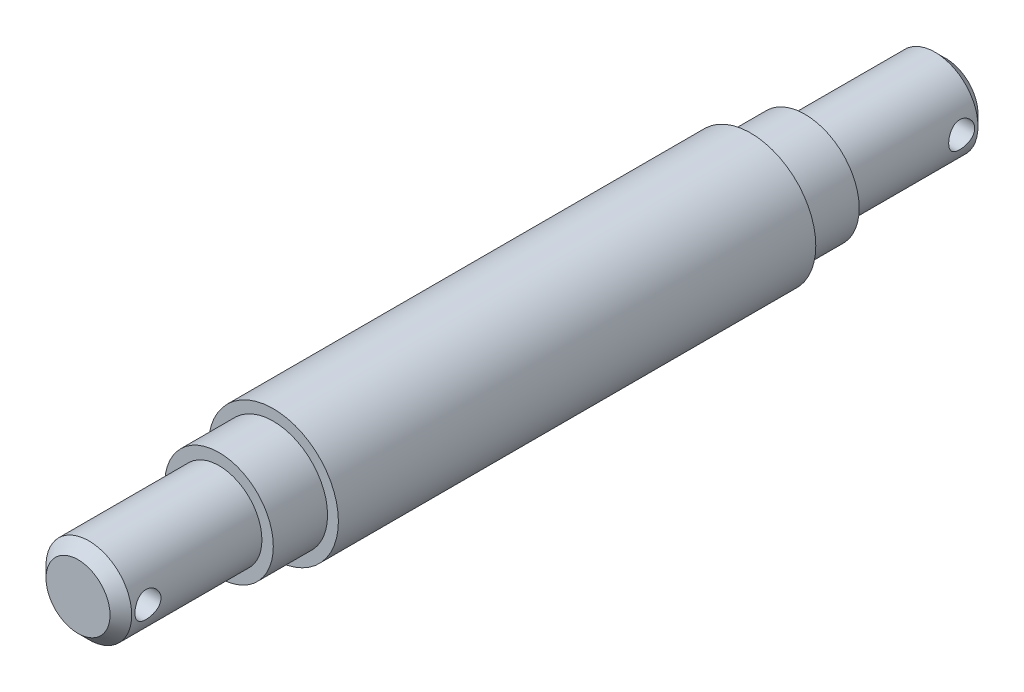
ISO-10303-21;
HEADER;
FILE_DESCRIPTION(('STEP AP214'),'2;1');
FILE_NAME('part.step','',(''),(''),'','','');
FILE_SCHEMA(('AUTOMOTIVE_DESIGN { 1 0 10303 214 1 1 1 1 }'));
ENDSEC;
DATA;
#1=APPLICATION_CONTEXT('core data for automotive mechanical design processes');
#2=APPLICATION_PROTOCOL_DEFINITION('international standard','automotive_design',2000,#1);
#3=PRODUCT_CONTEXT('',#1,'mechanical');
#4=PRODUCT('Part','Part','',(#3));
#5=PRODUCT_RELATED_PRODUCT_CATEGORY('part','',(#4));
#6=PRODUCT_DEFINITION_FORMATION('','',#4);
#7=PRODUCT_DEFINITION_CONTEXT('part definition',#1,'design');
#8=PRODUCT_DEFINITION('design','',#6,#7);
#9=PRODUCT_DEFINITION_SHAPE('','',#8);
#10=(LENGTH_UNIT() NAMED_UNIT(*) SI_UNIT(.MILLI.,.METRE.));
#11=(NAMED_UNIT(*) PLANE_ANGLE_UNIT() SI_UNIT($,.RADIAN.));
#12=(NAMED_UNIT(*) SI_UNIT($,.STERADIAN.) SOLID_ANGLE_UNIT());
#13=UNCERTAINTY_MEASURE_WITH_UNIT(LENGTH_MEASURE(1.E-05),#10,'distance_accuracy_value','');
#14=(GEOMETRIC_REPRESENTATION_CONTEXT(3) GLOBAL_UNCERTAINTY_ASSIGNED_CONTEXT((#13)) GLOBAL_UNIT_ASSIGNED_CONTEXT((#10,
#11,#12)) REPRESENTATION_CONTEXT('',''));
#15=CARTESIAN_POINT('',(0.,0.,0.));
#16=DIRECTION('',(0.,0.,1.));
#17=DIRECTION('',(1.,0.,0.));
#18=AXIS2_PLACEMENT_3D('',#15,#16,#17);
#19=CARTESIAN_POINT('',(0.,0.,-40.));
#20=DIRECTION('',(0.,0.,1.));
#21=DIRECTION('',(1.,0.,0.));
#22=AXIS2_PLACEMENT_3D('',#19,#20,#21);
#23=CYLINDRICAL_SURFACE('',#22,3.95);
#24=CARTESIAN_POINT('',(0.,0.,-39.));
#25=DIRECTION('',(0.,0.,-1.));
#26=DIRECTION('',(-1.,0.,0.));
#27=AXIS2_PLACEMENT_3D('',#24,#25,#26);
#28=CIRCLE('',#27,3.95);
#29=CARTESIAN_POINT('',(-3.95,0.,-39.));
#30=VERTEX_POINT('',#29);
#31=EDGE_CURVE('E42',#30,#30,#28,.F.);
#32=ORIENTED_EDGE('',*,*,#31,.T.);
#33=EDGE_LOOP('',(#32));
#34=FACE_BOUND('',#33,.T.);
#35=CARTESIAN_POINT('',(-3.95,0.,-38.7));
#36=CARTESIAN_POINT('',(-3.94999950148961,0.0657921053393099,-38.699999309067));
#37=CARTESIAN_POINT('',(-3.94834057311497,0.131591214838204,-38.6945713423082));
#38=CARTESIAN_POINT('',(-3.94188498697175,0.261270865350394,-38.6730560327882));
#39=CARTESIAN_POINT('',(-3.93708746139313,0.32515087062796,-38.6569657419196));
#40=CARTESIAN_POINT('',(-3.92487988296748,0.449103270402125,-38.6147143702164));
#41=CARTESIAN_POINT('',(-3.91747374305666,0.509181209664441,-38.5885683676363));
#42=CARTESIAN_POINT('',(-3.90081718663398,0.624100282433904,-38.5270102908556));
#43=CARTESIAN_POINT('',(-3.89156651099519,0.67894067854965,-38.4915969145227));
#44=CARTESIAN_POINT('',(-3.87190239177238,0.783438437222789,-38.4114139294501));
#45=CARTESIAN_POINT('',(-3.86146466337096,0.832920325244448,-38.3664216080813));
#46=CARTESIAN_POINT('',(-3.84074643294284,0.923765255505195,-38.2688324305187));
#47=CARTESIAN_POINT('',(-3.83046595848297,0.965126888957127,-38.2162342575258));
#48=CARTESIAN_POINT('',(-3.81096820781043,1.03948900030353,-38.1034313998918));
#49=CARTESIAN_POINT('',(-3.80178104820255,1.07227379069014,-38.0430788331166));
#50=CARTESIAN_POINT('',(-3.78587377700204,1.12715664878844,-37.9173927923664));
#51=CARTESIAN_POINT('',(-3.77915305597243,1.14925735687915,-37.8520605536529));
#52=CARTESIAN_POINT('',(-3.76919296296908,1.18150913793118,-37.7202430842059));
#53=CARTESIAN_POINT('',(-3.76585939822971,1.19198431895655,-37.6538444632701));
#54=CARTESIAN_POINT('',(-3.76277100880303,1.20169991107967,-37.5201549851538));
#55=CARTESIAN_POINT('',(-3.76301529202458,1.20094312272632,-37.4528643545652));
#56=CARTESIAN_POINT('',(-3.76697161773738,1.1884705081571,-37.3219501570623));
#57=CARTESIAN_POINT('',(-3.7705546058486,1.17716250700933,-37.2582831860542));
#58=CARTESIAN_POINT('',(-3.78057558453502,1.14456806673587,-37.1337964711495));
#59=CARTESIAN_POINT('',(-3.7870138633498,1.12328062017983,-37.0729770153932));
#60=CARTESIAN_POINT('',(-3.80212175360936,1.07103490290146,-36.9549220552885));
#61=CARTESIAN_POINT('',(-3.81082129239325,1.03994563160967,-36.897748519544));
#62=CARTESIAN_POINT('',(-3.82945730084039,0.969069803090082,-36.7892941375805));
#63=CARTESIAN_POINT('',(-3.8393940765405,0.929281092164123,-36.7380147553671));
#64=CARTESIAN_POINT('',(-3.85990662941459,0.840117660833637,-36.6404934453549));
#65=CARTESIAN_POINT('',(-3.87049153542939,0.790405027053214,-36.594561848265));
#66=CARTESIAN_POINT('',(-3.8907306221033,0.68385092805617,-36.5116141422669));
#67=CARTESIAN_POINT('',(-3.90038474113935,0.627008991414055,-36.474598623408));
#68=CARTESIAN_POINT('',(-3.91776652995739,0.507235607809567,-36.4103388738867));
#69=CARTESIAN_POINT('',(-3.92548020503653,0.444264225815946,-36.3831650382017));
#70=CARTESIAN_POINT('',(-3.93801108754001,0.314356032727513,-36.3398862787667));
#71=CARTESIAN_POINT('',(-3.94282912421219,0.247420362956474,-36.3237781858395));
#72=CARTESIAN_POINT('',(-3.94889402423303,0.114120636053965,-36.3036084028364));
#73=CARTESIAN_POINT('',(-3.95026547137128,0.0478257706931102,-36.2991262681458));
#74=CARTESIAN_POINT('',(-3.94964905795108,-0.084573966489267,-36.3011550878346));
#75=CARTESIAN_POINT('',(-3.94766165842204,-0.150678863138071,-36.3076645335288));
#76=CARTESIAN_POINT('',(-3.94063250926793,-0.279224843718514,-36.3311524846441));
#77=CARTESIAN_POINT('',(-3.93566287748284,-0.341715383064581,-36.3478839633591));
#78=CARTESIAN_POINT('',(-3.9232462867588,-0.462987512144225,-36.3910425635287));
#79=CARTESIAN_POINT('',(-3.91579902739437,-0.521768651064519,-36.4174708608141));
#80=CARTESIAN_POINT('',(-3.89897895098375,-0.635489778460971,-36.4799699305355));
#81=CARTESIAN_POINT('',(-3.88956496603778,-0.690306912058744,-36.5162528662978));
#82=CARTESIAN_POINT('',(-3.86989097410411,-0.793217107200203,-36.5971744514623));
#83=CARTESIAN_POINT('',(-3.85963075016098,-0.84130843583642,-36.6418152473685));
#84=CARTESIAN_POINT('',(-3.8389403158374,-0.931262194728945,-36.7401615057772));
#85=CARTESIAN_POINT('',(-3.82851804368209,-0.972825315903962,-36.7941430083754));
#86=CARTESIAN_POINT('',(-3.8090881755083,-1.04632580306949,-36.9085410089933));
#87=CARTESIAN_POINT('',(-3.80008054641565,-1.07826339411975,-36.9689573565118));
#88=CARTESIAN_POINT('',(-3.78460257028509,-1.13139313809661,-37.0943366498449));
#89=CARTESIAN_POINT('',(-3.77812098085674,-1.15263302867236,-37.1592778979753));
#90=CARTESIAN_POINT('',(-3.76847037643667,-1.18380847718296,-37.2920499847157));
#91=CARTESIAN_POINT('',(-3.76530018925136,-1.1937480353996,-37.3598797919581));
#92=CARTESIAN_POINT('',(-3.76274882724403,-1.20176405179564,-37.4933883668788));
#93=CARTESIAN_POINT('',(-3.76321151382289,-1.20032934218194,-37.559035178016));
#94=CARTESIAN_POINT('',(-3.76749719259433,-1.18680835860971,-37.6891050998603));
#95=CARTESIAN_POINT('',(-3.77132004375065,-1.17472253171075,-37.7535282618118));
#96=CARTESIAN_POINT('',(-3.78178924861813,-1.14056150948796,-37.8785005993841));
#97=CARTESIAN_POINT('',(-3.7883980639779,-1.11861887679373,-37.9390893895407));
#98=CARTESIAN_POINT('',(-3.80368682812306,-1.06547063438703,-38.0557739216337));
#99=CARTESIAN_POINT('',(-3.81236718094976,-1.03426321734227,-38.1118687842014));
#100=CARTESIAN_POINT('',(-3.83122441855044,-0.962110752635532,-38.2202335502225));
#101=CARTESIAN_POINT('',(-3.84144499898209,-0.920846329538669,-38.2722831917953));
#102=CARTESIAN_POINT('',(-3.86202232713825,-0.830322181374976,-38.3688776312579));
#103=CARTESIAN_POINT('',(-3.872379109857,-0.781060363153478,-38.4134204581551));
#104=CARTESIAN_POINT('',(-3.89243751616363,-0.674145848788933,-38.4950812638234));
#105=CARTESIAN_POINT('',(-3.90210985106116,-0.616284435684861,-38.5319339365529));
#106=CARTESIAN_POINT('',(-3.91935319911683,-0.494893212202998,-38.5953376113773));
#107=CARTESIAN_POINT('',(-3.92692514826385,-0.431365943417147,-38.6218932042363));
#108=CARTESIAN_POINT('',(-3.93849330935894,-0.307034616834357,-38.6617030372843));
#109=CARTESIAN_POINT('',(-3.94277212268364,-0.246597141950738,-38.6760247532901));
#110=CARTESIAN_POINT('',(-3.94852545465588,-0.124108329921256,-38.6951727192245));
#111=CARTESIAN_POINT('',(-3.95000047021142,-0.0620572807202991,-38.7000006517107));
#112=CARTESIAN_POINT('',(-3.95,0.,-38.7));
#113=B_SPLINE_CURVE_WITH_KNOTS('',3,(#35,#36,#37,#38,#39,#40,#41,#42,#43,#44,#45,#46,#47,#48,
#49,#50,#51,#52,#53,#54,#55,#56,#57,#58,#59,#60,#61,#62,#63,#64,#65,#66,#67,#68,#69,#70,#71,#72,
#73,#74,#75,#76,#77,#78,#79,#80,#81,#82,#83,#84,#85,#86,#87,#88,#89,#90,#91,#92,#93,#94,#95,#96,
#97,#98,#99,#100,#101,#102,#103,#104,#105,#106,#107,#108,#109,#110,#111,#112),.UNSPECIFIED.,.T.,
.F.,(4,2,2,2,2,2,2,2,2,2,2,2,2,2,2,2,2,2,2,2,2,2,2,2,2,2,2,2,2,2,2,2,2,2,2,2,2,2,4),(0.,
0.197148320035393,0.394351173873385,0.591259473294286,0.788195454606494,0.990340802366876,
1.19252118949645,1.39938126808359,1.60619019875128,1.80707614853398,2.00791201079835,
2.20129315930618,2.39469383394964,2.59079745889567,2.78694968780097,2.99151370492323,
3.19609125598955,3.40210447220443,3.6080586625695,3.80645362401528,4.00482135632749,
4.19857515486446,4.39235245564506,4.59068721838335,4.7890729884132,4.99485980438991,
5.20064180838011,5.40549720473314,5.61028006032374,5.80631124083042,6.00233419370823,
6.19579632450157,6.38929621983989,6.59000270555274,6.790761807026,6.99759277849253,
7.20433143185223,7.39032118612838,7.57627797496915),.UNSPECIFIED.);
#114=CARTESIAN_POINT('',(-3.95,0.,-38.7));
#115=VERTEX_POINT('',#114);
#116=EDGE_CURVE('E62',#115,#115,#113,.T.);
#117=ORIENTED_EDGE('',*,*,#116,.T.);
#118=EDGE_LOOP('',(#117));
#119=FACE_BOUND('',#118,.T.);
#120=CARTESIAN_POINT('',(0.,0.,-27.));
#121=DIRECTION('',(0.,0.,1.));
#122=DIRECTION('',(1.,0.,0.));
#123=AXIS2_PLACEMENT_3D('',#120,#121,#122);
#124=CIRCLE('',#123,3.95);
#125=CARTESIAN_POINT('',(3.95,0.,-27.));
#126=VERTEX_POINT('',#125);
#127=EDGE_CURVE('E61',#126,#126,#124,.T.);
#128=ORIENTED_EDGE('',*,*,#127,.F.);
#129=EDGE_LOOP('',(#128));
#130=FACE_BOUND('',#129,.T.);
#131=CARTESIAN_POINT('',(3.95,0.,-38.7));
#132=CARTESIAN_POINT('',(3.94999950148961,-0.0657921053393098,-38.699999309067));
#133=CARTESIAN_POINT('',(3.94834057311497,-0.131591214838204,-38.6945713423082));
#134=CARTESIAN_POINT('',(3.94188498697175,-0.261270865350394,-38.6730560327882));
#135=CARTESIAN_POINT('',(3.93708746139313,-0.32515087062796,-38.6569657419196));
#136=CARTESIAN_POINT('',(3.92487988296748,-0.449103270402124,-38.6147143702164));
#137=CARTESIAN_POINT('',(3.91747374305666,-0.50918120966444,-38.5885683676363));
#138=CARTESIAN_POINT('',(3.90081718663398,-0.624100282433903,-38.5270102908556));
#139=CARTESIAN_POINT('',(3.89156651099519,-0.678940678549649,-38.4915969145227));
#140=CARTESIAN_POINT('',(3.87190239177238,-0.783438437222789,-38.4114139294501));
#141=CARTESIAN_POINT('',(3.86146466337096,-0.832920325244448,-38.3664216080813));
#142=CARTESIAN_POINT('',(3.84074643294284,-0.923765255505197,-38.2688324305187));
#143=CARTESIAN_POINT('',(3.83046595848297,-0.965126888957129,-38.2162342575258));
#144=CARTESIAN_POINT('',(3.81096820781043,-1.03948900030353,-38.1034313998918));
#145=CARTESIAN_POINT('',(3.80178104820255,-1.07227379069014,-38.0430788331166));
#146=CARTESIAN_POINT('',(3.78587377700204,-1.12715664878844,-37.9173927923664));
#147=CARTESIAN_POINT('',(3.77915305597243,-1.14925735687915,-37.8520605536529));
#148=CARTESIAN_POINT('',(3.76919296296908,-1.18150913793118,-37.7202430842059));
#149=CARTESIAN_POINT('',(3.76585939822971,-1.19198431895655,-37.6538444632701));
#150=CARTESIAN_POINT('',(3.76277100880303,-1.20169991107967,-37.5201549851538));
#151=CARTESIAN_POINT('',(3.76301529202458,-1.20094312272632,-37.4528643545652));
#152=CARTESIAN_POINT('',(3.76697161773738,-1.1884705081571,-37.3219501570623));
#153=CARTESIAN_POINT('',(3.7705546058486,-1.17716250700933,-37.2582831860542));
#154=CARTESIAN_POINT('',(3.78057558453502,-1.14456806673587,-37.1337964711495));
#155=CARTESIAN_POINT('',(3.7870138633498,-1.12328062017983,-37.0729770153932));
#156=CARTESIAN_POINT('',(3.80212175360936,-1.07103490290146,-36.9549220552885));
#157=CARTESIAN_POINT('',(3.81082129239325,-1.03994563160967,-36.897748519544));
#158=CARTESIAN_POINT('',(3.82945730084038,-0.969069803090084,-36.7892941375805));
#159=CARTESIAN_POINT('',(3.8393940765405,-0.929281092164127,-36.7380147553672));
#160=CARTESIAN_POINT('',(3.85990662941459,-0.840117660833645,-36.6404934453549));
#161=CARTESIAN_POINT('',(3.87049153542939,-0.790405027053224,-36.594561848265));
#162=CARTESIAN_POINT('',(3.8907306221033,-0.683850928056181,-36.5116141422669));
#163=CARTESIAN_POINT('',(3.90038474113935,-0.627008991414064,-36.474598623408));
#164=CARTESIAN_POINT('',(3.91776652995739,-0.507235607809574,-36.4103388738867));
#165=CARTESIAN_POINT('',(3.92548020503653,-0.444264225815951,-36.3831650382018));
#166=CARTESIAN_POINT('',(3.93801108754001,-0.314356032727516,-36.3398862787667));
#167=CARTESIAN_POINT('',(3.94282912421219,-0.247420362956476,-36.3237781858395));
#168=CARTESIAN_POINT('',(3.94889402423303,-0.114120636053966,-36.3036084028364));
#169=CARTESIAN_POINT('',(3.95026547137128,-0.047825770693111,-36.2991262681458));
#170=CARTESIAN_POINT('',(3.94964905795108,0.0845739664892664,-36.3011550878346));
#171=CARTESIAN_POINT('',(3.94766165842204,0.150678863138071,-36.3076645335288));
#172=CARTESIAN_POINT('',(3.94063250926793,0.279224843718514,-36.3311524846441));
#173=CARTESIAN_POINT('',(3.93566287748284,0.341715383064581,-36.3478839633591));
#174=CARTESIAN_POINT('',(3.9232462867588,0.462987512144226,-36.3910425635287));
#175=CARTESIAN_POINT('',(3.91579902739437,0.52176865106452,-36.4174708608141));
#176=CARTESIAN_POINT('',(3.89897895098375,0.635489778460971,-36.4799699305355));
#177=CARTESIAN_POINT('',(3.88956496603778,0.690306912058743,-36.5162528662978));
#178=CARTESIAN_POINT('',(3.86989097410411,0.793217107200203,-36.5971744514623));
#179=CARTESIAN_POINT('',(3.85963075016098,0.84130843583642,-36.6418152473685));
#180=CARTESIAN_POINT('',(3.8389403158374,0.931262194728945,-36.7401615057772));
#181=CARTESIAN_POINT('',(3.82851804368209,0.972825315903962,-36.7941430083754));
#182=CARTESIAN_POINT('',(3.8090881755083,1.04632580306949,-36.9085410089933));
#183=CARTESIAN_POINT('',(3.80008054641565,1.07826339411975,-36.9689573565118));
#184=CARTESIAN_POINT('',(3.78460257028509,1.13139313809661,-37.0943366498449));
#185=CARTESIAN_POINT('',(3.77812098085674,1.15263302867236,-37.1592778979753));
#186=CARTESIAN_POINT('',(3.76847037643667,1.18380847718296,-37.2920499847157));
#187=CARTESIAN_POINT('',(3.76530018925136,1.1937480353996,-37.3598797919581));
#188=CARTESIAN_POINT('',(3.76274882724403,1.20176405179564,-37.4933883668788));
#189=CARTESIAN_POINT('',(3.76321151382289,1.20032934218194,-37.559035178016));
#190=CARTESIAN_POINT('',(3.76749719259433,1.18680835860971,-37.6891050998603));
#191=CARTESIAN_POINT('',(3.77132004375065,1.17472253171075,-37.7535282618118));
#192=CARTESIAN_POINT('',(3.78178924861813,1.14056150948796,-37.8785005993841));
#193=CARTESIAN_POINT('',(3.7883980639779,1.11861887679373,-37.9390893895407));
#194=CARTESIAN_POINT('',(3.80368682812306,1.06547063438703,-38.0557739216337));
#195=CARTESIAN_POINT('',(3.81236718094976,1.03426321734227,-38.1118687842014));
#196=CARTESIAN_POINT('',(3.83122441855044,0.962110752635532,-38.2202335502225));
#197=CARTESIAN_POINT('',(3.84144499898209,0.920846329538669,-38.2722831917953));
#198=CARTESIAN_POINT('',(3.86202232713825,0.830322181374976,-38.3688776312579));
#199=CARTESIAN_POINT('',(3.872379109857,0.781060363153478,-38.4134204581551));
#200=CARTESIAN_POINT('',(3.89243751616363,0.674145848788933,-38.4950812638234));
#201=CARTESIAN_POINT('',(3.90210985106116,0.61628443568486,-38.5319339365529));
#202=CARTESIAN_POINT('',(3.91935319911683,0.494893212202997,-38.5953376113773));
#203=CARTESIAN_POINT('',(3.92692514826385,0.431365943417147,-38.6218932042363));
#204=CARTESIAN_POINT('',(3.93849330935894,0.307034616834357,-38.6617030372843));
#205=CARTESIAN_POINT('',(3.94277212268364,0.246597141950737,-38.6760247532901));
#206=CARTESIAN_POINT('',(3.94852545465588,0.124108329921255,-38.6951727192245));
#207=CARTESIAN_POINT('',(3.95000047021142,0.0620572807202984,-38.7000006517107));
#208=CARTESIAN_POINT('',(3.95,0.,-38.7));
#209=B_SPLINE_CURVE_WITH_KNOTS('',3,(#131,#132,#133,#134,#135,#136,#137,#138,#139,#140,#141,
#142,#143,#144,#145,#146,#147,#148,#149,#150,#151,#152,#153,#154,#155,#156,#157,#158,#159,#160,
#161,#162,#163,#164,#165,#166,#167,#168,#169,#170,#171,#172,#173,#174,#175,#176,#177,#178,#179,
#180,#181,#182,#183,#184,#185,#186,#187,#188,#189,#190,#191,#192,#193,#194,#195,#196,#197,#198,
#199,#200,#201,#202,#203,#204,#205,#206,#207,#208),.UNSPECIFIED.,.T.,.F.,(4,2,2,2,2,2,2,2,2,2,2,
2,2,2,2,2,2,2,2,2,2,2,2,2,2,2,2,2,2,2,2,2,2,2,2,2,2,2,4),(0.,0.197148320035393,
0.394351173873385,0.591259473294281,0.788195454606495,0.990340802366877,1.19252118949645,
1.39938126808359,1.60619019875128,1.80707614853397,2.00791201079835,2.20129315930618,
2.39469383394964,2.59079745889567,2.78694968780096,2.99151370492322,3.19609125598954,
3.40210447220442,3.6080586625695,3.80645362401528,4.00482135632749,4.19857515486446,
4.39235245564506,4.59068721838335,4.7890729884132,4.99485980438991,5.20064180838011,
5.40549720473314,5.61028006032374,5.80631124083042,6.00233419370823,6.19579632450157,
6.38929621983989,6.59000270555274,6.790761807026,6.99759277849253,7.20433143185223,
7.39032118612838,7.57627797496915),.UNSPECIFIED.);
#210=CARTESIAN_POINT('',(3.95,0.,-38.7));
#211=VERTEX_POINT('',#210);
#212=EDGE_CURVE('E53',#211,#211,#209,.T.);
#213=ORIENTED_EDGE('',*,*,#212,.T.);
#214=EDGE_LOOP('',(#213));
#215=FACE_BOUND('',#214,.T.);
#216=ADVANCED_FACE('F34',(#34,#119,#130,#215),#23,.T.);
#217=CARTESIAN_POINT('',(0.,0.,22.));
#218=DIRECTION('',(0.,0.,-1.));
#219=DIRECTION('',(-1.,0.,0.));
#220=AXIS2_PLACEMENT_3D('',#217,#218,#219);
#221=CYLINDRICAL_SURFACE('',#220,6.);
#222=CARTESIAN_POINT('',(0.,0.,22.));
#223=DIRECTION('',(0.,0.,1.));
#224=DIRECTION('',(1.,0.,0.));
#225=AXIS2_PLACEMENT_3D('',#222,#223,#224);
#226=CIRCLE('',#225,6.);
#227=CARTESIAN_POINT('',(6.,0.,22.));
#228=VERTEX_POINT('',#227);
#229=EDGE_CURVE('E119',#228,#228,#226,.T.);
#230=ORIENTED_EDGE('',*,*,#229,.F.);
#231=EDGE_LOOP('',(#230));
#232=FACE_BOUND('',#231,.T.);
#233=CARTESIAN_POINT('',(0.,0.,-22.));
#234=DIRECTION('',(0.,0.,1.));
#235=DIRECTION('',(1.,0.,0.));
#236=AXIS2_PLACEMENT_3D('',#233,#234,#235);
#237=CIRCLE('',#236,6.);
#238=CARTESIAN_POINT('',(6.,0.,-22.));
#239=VERTEX_POINT('',#238);
#240=EDGE_CURVE('E115',#239,#239,#237,.T.);
#241=ORIENTED_EDGE('',*,*,#240,.T.);
#242=EDGE_LOOP('',(#241));
#243=FACE_BOUND('',#242,.T.);
#244=ADVANCED_FACE('F83',(#232,#243),#221,.T.);
#245=CARTESIAN_POINT('',(0.,0.,22.));
#246=DIRECTION('',(0.,0.,1.));
#247=DIRECTION('',(1.,0.,0.));
#248=AXIS2_PLACEMENT_3D('',#245,#246,#247);
#249=PLANE('',#248);
#250=CARTESIAN_POINT('',(0.,0.,22.));
#251=DIRECTION('',(0.,0.,1.));
#252=DIRECTION('',(1.,0.,0.));
#253=AXIS2_PLACEMENT_3D('',#250,#251,#252);
#254=CIRCLE('',#253,5.);
#255=CARTESIAN_POINT('',(5.,0.,22.));
#256=VERTEX_POINT('',#255);
#257=EDGE_CURVE('E111',#256,#256,#254,.T.);
#258=ORIENTED_EDGE('',*,*,#257,.F.);
#259=EDGE_LOOP('',(#258));
#260=FACE_BOUND('',#259,.T.);
#261=ORIENTED_EDGE('',*,*,#229,.T.);
#262=EDGE_LOOP('',(#261));
#263=FACE_BOUND('',#262,.T.);
#264=ADVANCED_FACE('F87',(#260,#263),#249,.T.);
#265=CARTESIAN_POINT('',(0.,0.,-22.));
#266=DIRECTION('',(0.,0.,1.));
#267=DIRECTION('',(1.,0.,0.));
#268=AXIS2_PLACEMENT_3D('',#265,#266,#267);
#269=PLANE('',#268);
#270=CARTESIAN_POINT('',(0.,0.,-22.));
#271=DIRECTION('',(0.,0.,1.));
#272=DIRECTION('',(1.,0.,0.));
#273=AXIS2_PLACEMENT_3D('',#270,#271,#272);
#274=CIRCLE('',#273,5.);
#275=CARTESIAN_POINT('',(5.,0.,-22.));
#276=VERTEX_POINT('',#275);
#277=EDGE_CURVE('E99',#276,#276,#274,.T.);
#278=ORIENTED_EDGE('',*,*,#277,.T.);
#279=EDGE_LOOP('',(#278));
#280=FACE_BOUND('',#279,.T.);
#281=ORIENTED_EDGE('',*,*,#240,.F.);
#282=EDGE_LOOP('',(#281));
#283=FACE_BOUND('',#282,.T.);
#284=ADVANCED_FACE('F168',(#280,#283),#269,.F.);
#285=CARTESIAN_POINT('',(0.,0.,27.));
#286=DIRECTION('',(0.,0.,-1.));
#287=DIRECTION('',(-1.,0.,0.));
#288=AXIS2_PLACEMENT_3D('',#285,#286,#287);
#289=CYLINDRICAL_SURFACE('',#288,5.);
#290=CARTESIAN_POINT('',(0.,0.,27.));
#291=DIRECTION('',(0.,0.,1.));
#292=DIRECTION('',(1.,0.,0.));
#293=AXIS2_PLACEMENT_3D('',#290,#291,#292);
#294=CIRCLE('',#293,5.);
#295=CARTESIAN_POINT('',(5.,0.,27.));
#296=VERTEX_POINT('',#295);
#297=EDGE_CURVE('E112',#296,#296,#294,.T.);
#298=ORIENTED_EDGE('',*,*,#297,.F.);
#299=EDGE_LOOP('',(#298));
#300=FACE_BOUND('',#299,.T.);
#301=ORIENTED_EDGE('',*,*,#257,.T.);
#302=EDGE_LOOP('',(#301));
#303=FACE_BOUND('',#302,.T.);
#304=ADVANCED_FACE('F171',(#300,#303),#289,.T.);
#305=CARTESIAN_POINT('',(0.,0.,27.));
#306=DIRECTION('',(0.,0.,1.));
#307=DIRECTION('',(1.,0.,0.));
#308=AXIS2_PLACEMENT_3D('',#305,#306,#307);
#309=PLANE('',#308);
#310=CARTESIAN_POINT('',(0.,0.,27.));
#311=DIRECTION('',(0.,0.,1.));
#312=DIRECTION('',(1.,0.,0.));
#313=AXIS2_PLACEMENT_3D('',#310,#311,#312);
#314=CIRCLE('',#313,3.95);
#315=CARTESIAN_POINT('',(3.95,0.,27.));
#316=VERTEX_POINT('',#315);
#317=EDGE_CURVE('E108',#316,#316,#314,.T.);
#318=ORIENTED_EDGE('',*,*,#317,.F.);
#319=EDGE_LOOP('',(#318));
#320=FACE_BOUND('',#319,.T.);
#321=ORIENTED_EDGE('',*,*,#297,.T.);
#322=EDGE_LOOP('',(#321));
#323=FACE_BOUND('',#322,.T.);
#324=ADVANCED_FACE('F152',(#320,#323),#309,.T.);
#325=CARTESIAN_POINT('',(0.,0.,40.));
#326=DIRECTION('',(0.,0.,-1.));
#327=DIRECTION('',(-1.,0.,0.));
#328=AXIS2_PLACEMENT_3D('',#325,#326,#327);
#329=CYLINDRICAL_SURFACE('',#328,3.95);
#330=CARTESIAN_POINT('',(0.,0.,39.));
#331=DIRECTION('',(0.,0.,1.));
#332=DIRECTION('',(1.,0.,0.));
#333=AXIS2_PLACEMENT_3D('',#330,#331,#332);
#334=CIRCLE('',#333,3.95);
#335=CARTESIAN_POINT('',(3.95,0.,39.));
#336=VERTEX_POINT('',#335);
#337=EDGE_CURVE('E46',#336,#336,#334,.F.);
#338=ORIENTED_EDGE('',*,*,#337,.T.);
#339=EDGE_LOOP('',(#338));
#340=FACE_BOUND('',#339,.T.);
#341=CARTESIAN_POINT('',(-3.95,0.,38.7));
#342=CARTESIAN_POINT('',(-3.94999950148961,-0.0657921053393098,38.699999309067));
#343=CARTESIAN_POINT('',(-3.94834057311497,-0.131591214838204,38.6945713423082));
#344=CARTESIAN_POINT('',(-3.94188498697175,-0.261270865350394,38.6730560327882));
#345=CARTESIAN_POINT('',(-3.93708746139313,-0.32515087062796,38.6569657419196));
#346=CARTESIAN_POINT('',(-3.92487988296748,-0.449103270402123,38.6147143702164));
#347=CARTESIAN_POINT('',(-3.91747374305666,-0.509181209664438,38.5885683676363));
#348=CARTESIAN_POINT('',(-3.90081718663398,-0.624100282433901,38.5270102908556));
#349=CARTESIAN_POINT('',(-3.89156651099519,-0.678940678549648,38.4915969145227));
#350=CARTESIAN_POINT('',(-3.87190239177238,-0.783438437222788,38.4114139294501));
#351=CARTESIAN_POINT('',(-3.86146466337096,-0.832920325244447,38.3664216080813));
#352=CARTESIAN_POINT('',(-3.84074643294284,-0.923765255505195,38.2688324305187));
#353=CARTESIAN_POINT('',(-3.83046595848297,-0.965126888957127,38.2162342575258));
#354=CARTESIAN_POINT('',(-3.81096820781043,-1.03948900030353,38.1034313998918));
#355=CARTESIAN_POINT('',(-3.80178104820255,-1.07227379069014,38.0430788331166));
#356=CARTESIAN_POINT('',(-3.78587377700204,-1.12715664878844,37.9173927923664));
#357=CARTESIAN_POINT('',(-3.77915305597243,-1.14925735687915,37.8520605536529));
#358=CARTESIAN_POINT('',(-3.76919296296908,-1.18150913793118,37.7202430842059));
#359=CARTESIAN_POINT('',(-3.76585939822971,-1.19198431895655,37.6538444632701));
#360=CARTESIAN_POINT('',(-3.76277100880303,-1.20169991107967,37.5201549851538));
#361=CARTESIAN_POINT('',(-3.76301529202458,-1.20094312272632,37.4528643545652));
#362=CARTESIAN_POINT('',(-3.76697161773738,-1.1884705081571,37.3219501570623));
#363=CARTESIAN_POINT('',(-3.7705546058486,-1.17716250700933,37.2582831860542));
#364=CARTESIAN_POINT('',(-3.78057558453502,-1.14456806673587,37.1337964711495));
#365=CARTESIAN_POINT('',(-3.7870138633498,-1.12328062017983,37.0729770153932));
#366=CARTESIAN_POINT('',(-3.80212175360936,-1.07103490290146,36.9549220552885));
#367=CARTESIAN_POINT('',(-3.81082129239325,-1.03994563160967,36.897748519544));
#368=CARTESIAN_POINT('',(-3.82945730084039,-0.969069803090082,36.7892941375805));
#369=CARTESIAN_POINT('',(-3.8393940765405,-0.929281092164123,36.7380147553671));
#370=CARTESIAN_POINT('',(-3.85990662941459,-0.840117660833637,36.6404934453549));
#371=CARTESIAN_POINT('',(-3.87049153542939,-0.790405027053214,36.594561848265));
#372=CARTESIAN_POINT('',(-3.8907306221033,-0.68385092805617,36.5116141422669));
#373=CARTESIAN_POINT('',(-3.90038474113935,-0.627008991414054,36.474598623408));
#374=CARTESIAN_POINT('',(-3.91776652995739,-0.507235607809567,36.4103388738867));
#375=CARTESIAN_POINT('',(-3.92548020503653,-0.444264225815946,36.3831650382017));
#376=CARTESIAN_POINT('',(-3.93801108754001,-0.314356032727514,36.3398862787667));
#377=CARTESIAN_POINT('',(-3.94282912421219,-0.247420362956474,36.3237781858395));
#378=CARTESIAN_POINT('',(-3.94889402423303,-0.114120636053965,36.3036084028364));
#379=CARTESIAN_POINT('',(-3.95026547137128,-0.0478257706931107,36.2991262681458));
#380=CARTESIAN_POINT('',(-3.94964905795108,0.0845739664892664,36.3011550878346));
#381=CARTESIAN_POINT('',(-3.94766165842204,0.150678863138071,36.3076645335288));
#382=CARTESIAN_POINT('',(-3.94063250926792,0.279224843718514,36.3311524846441));
#383=CARTESIAN_POINT('',(-3.93566287748284,0.341715383064582,36.3478839633591));
#384=CARTESIAN_POINT('',(-3.9232462867588,0.462987512144226,36.3910425635287));
#385=CARTESIAN_POINT('',(-3.91579902739437,0.521768651064518,36.4174708608141));
#386=CARTESIAN_POINT('',(-3.89897895098375,0.635489778460968,36.4799699305355));
#387=CARTESIAN_POINT('',(-3.88956496603778,0.690306912058741,36.5162528662978));
#388=CARTESIAN_POINT('',(-3.86989097410411,0.793217107200201,36.5971744514623));
#389=CARTESIAN_POINT('',(-3.85963075016098,0.841308435836419,36.6418152473685));
#390=CARTESIAN_POINT('',(-3.8389403158374,0.931262194728941,36.7401615057772));
#391=CARTESIAN_POINT('',(-3.82851804368209,0.972825315903957,36.7941430083754));
#392=CARTESIAN_POINT('',(-3.8090881755083,1.04632580306949,36.9085410089933));
#393=CARTESIAN_POINT('',(-3.80008054641565,1.07826339411975,36.9689573565118));
#394=CARTESIAN_POINT('',(-3.78460257028509,1.13139313809661,37.0943366498449));
#395=CARTESIAN_POINT('',(-3.77812098085674,1.15263302867236,37.1592778979753));
#396=CARTESIAN_POINT('',(-3.76847037643667,1.18380847718295,37.2920499847157));
#397=CARTESIAN_POINT('',(-3.76530018925136,1.1937480353996,37.3598797919581));
#398=CARTESIAN_POINT('',(-3.76274882724403,1.20176405179564,37.4933883668788));
#399=CARTESIAN_POINT('',(-3.76321151382289,1.20032934218194,37.559035178016));
#400=CARTESIAN_POINT('',(-3.76749719259433,1.18680835860971,37.6891050998603));
#401=CARTESIAN_POINT('',(-3.77132004375065,1.17472253171075,37.7535282618118));
#402=CARTESIAN_POINT('',(-3.78178924861813,1.14056150948796,37.8785005993841));
#403=CARTESIAN_POINT('',(-3.7883980639779,1.11861887679373,37.9390893895407));
#404=CARTESIAN_POINT('',(-3.80368682812306,1.06547063438703,38.0557739216337));
#405=CARTESIAN_POINT('',(-3.81236718094976,1.03426321734227,38.1118687842014));
#406=CARTESIAN_POINT('',(-3.83122441855044,0.962110752635532,38.2202335502225));
#407=CARTESIAN_POINT('',(-3.84144499898209,0.920846329538669,38.2722831917953));
#408=CARTESIAN_POINT('',(-3.86202232713825,0.830322181374976,38.3688776312579));
#409=CARTESIAN_POINT('',(-3.872379109857,0.781060363153478,38.4134204581551));
#410=CARTESIAN_POINT('',(-3.89243751616363,0.674145848788933,38.4950812638234));
#411=CARTESIAN_POINT('',(-3.90210985106116,0.616284435684861,38.5319339365529));
#412=CARTESIAN_POINT('',(-3.91935319911683,0.494893212202997,38.5953376113773));
#413=CARTESIAN_POINT('',(-3.92692514826385,0.431365943417147,38.6218932042363));
#414=CARTESIAN_POINT('',(-3.93849330935894,0.307034616834357,38.6617030372843));
#415=CARTESIAN_POINT('',(-3.94277212268364,0.246597141950738,38.6760247532901));
#416=CARTESIAN_POINT('',(-3.94852545465588,0.124108329921256,38.6951727192245));
#417=CARTESIAN_POINT('',(-3.95000047021142,0.062057280720299,38.7000006517107));
#418=CARTESIAN_POINT('',(-3.95,0.,38.7));
#419=B_SPLINE_CURVE_WITH_KNOTS('',3,(#341,#342,#343,#344,#345,#346,#347,#348,#349,#350,#351,
#352,#353,#354,#355,#356,#357,#358,#359,#360,#361,#362,#363,#364,#365,#366,#367,#368,#369,#370,
#371,#372,#373,#374,#375,#376,#377,#378,#379,#380,#381,#382,#383,#384,#385,#386,#387,#388,#389,
#390,#391,#392,#393,#394,#395,#396,#397,#398,#399,#400,#401,#402,#403,#404,#405,#406,#407,#408,
#409,#410,#411,#412,#413,#414,#415,#416,#417,#418),.UNSPECIFIED.,.T.,.F.,(4,2,2,2,2,2,2,2,2,2,2,
2,2,2,2,2,2,2,2,2,2,2,2,2,2,2,2,2,2,2,2,2,2,2,2,2,2,2,4),(0.,0.197148320035393,
0.394351173873385,0.591259473294278,0.788195454606494,0.990340802366876,1.19252118949645,
1.39938126808359,1.60619019875128,1.80707614853398,2.00791201079835,2.20129315930618,
2.39469383394964,2.59079745889567,2.78694968780097,2.99151370492324,3.19609125598955,
3.40210447220443,3.6080586625695,3.80645362401528,4.00482135632749,4.19857515486446,
4.39235245564506,4.59068721838334,4.7890729884132,4.9948598043899,5.2006418083801,
5.40549720473315,5.61028006032374,5.80631124083042,6.00233419370823,6.19579632450157,
6.38929621983989,6.59000270555274,6.790761807026,6.99759277849253,7.20433143185223,
7.39032118612838,7.57627797496915),.UNSPECIFIED.);
#420=CARTESIAN_POINT('',(-3.95,0.,38.7));
#421=VERTEX_POINT('',#420);
#422=EDGE_CURVE('E116',#421,#421,#419,.T.);
#423=ORIENTED_EDGE('',*,*,#422,.T.);
#424=EDGE_LOOP('',(#423));
#425=FACE_BOUND('',#424,.T.);
#426=CARTESIAN_POINT('',(3.95,0.,36.3));
#427=CARTESIAN_POINT('',(3.94999950148961,-0.0657921053393098,36.300000690933));
#428=CARTESIAN_POINT('',(3.94834057311497,-0.131591214838204,36.3054286576918));
#429=CARTESIAN_POINT('',(3.94188498697175,-0.261270865350394,36.3269439672118));
#430=CARTESIAN_POINT('',(3.93708746139313,-0.32515087062796,36.3430342580804));
#431=CARTESIAN_POINT('',(3.92487988296748,-0.449103270402123,36.3852856297836));
#432=CARTESIAN_POINT('',(3.91747374305666,-0.509181209664438,36.4114316323637));
#433=CARTESIAN_POINT('',(3.90081718663398,-0.624100282433901,36.4729897091444));
#434=CARTESIAN_POINT('',(3.89156651099519,-0.678940678549648,36.5084030854773));
#435=CARTESIAN_POINT('',(3.87190239177238,-0.783438437222786,36.5885860705499));
#436=CARTESIAN_POINT('',(3.86146466337096,-0.832920325244443,36.6335783919187));
#437=CARTESIAN_POINT('',(3.84074643294284,-0.923765255505193,36.7311675694813));
#438=CARTESIAN_POINT('',(3.83046595848297,-0.965126888957128,36.7837657424742));
#439=CARTESIAN_POINT('',(3.81096820781043,-1.03948900030353,36.8965686001082));
#440=CARTESIAN_POINT('',(3.80178104820255,-1.07227379069014,36.9569211668834));
#441=CARTESIAN_POINT('',(3.78587377700205,-1.12715664878844,37.0826072076336));
#442=CARTESIAN_POINT('',(3.77915305597243,-1.14925735687914,37.1479394463471));
#443=CARTESIAN_POINT('',(3.76919296296908,-1.18150913793118,37.2797569157941));
#444=CARTESIAN_POINT('',(3.76585939822971,-1.19198431895655,37.3461555367299));
#445=CARTESIAN_POINT('',(3.76277100880303,-1.20169991107967,37.4798450148462));
#446=CARTESIAN_POINT('',(3.76301529202458,-1.20094312272632,37.5471356454348));
#447=CARTESIAN_POINT('',(3.76697161773738,-1.1884705081571,37.6780498429377));
#448=CARTESIAN_POINT('',(3.7705546058486,-1.17716250700933,37.7417168139458));
#449=CARTESIAN_POINT('',(3.78057558453502,-1.14456806673587,37.8662035288505));
#450=CARTESIAN_POINT('',(3.7870138633498,-1.12328062017983,37.9270229846068));
#451=CARTESIAN_POINT('',(3.80212175360936,-1.07103490290146,38.0450779447115));
#452=CARTESIAN_POINT('',(3.81082129239325,-1.03994563160967,38.102251480456));
#453=CARTESIAN_POINT('',(3.82945730084038,-0.969069803090084,38.2107058624195));
#454=CARTESIAN_POINT('',(3.8393940765405,-0.929281092164127,38.2619852446328));
#455=CARTESIAN_POINT('',(3.85990662941459,-0.840117660833644,38.359506554645));
#456=CARTESIAN_POINT('',(3.87049153542939,-0.790405027053224,38.405438151735));
#457=CARTESIAN_POINT('',(3.8907306221033,-0.683850928056181,38.4883858577331));
#458=CARTESIAN_POINT('',(3.90038474113935,-0.627008991414064,38.525401376592));
#459=CARTESIAN_POINT('',(3.91776652995739,-0.507235607809573,38.5896611261133));
#460=CARTESIAN_POINT('',(3.92548020503653,-0.444264225815951,38.6168349617982));
#461=CARTESIAN_POINT('',(3.93801108754001,-0.314356032727516,38.6601137212333));
#462=CARTESIAN_POINT('',(3.94282912421219,-0.247420362956476,38.6762218141605));
#463=CARTESIAN_POINT('',(3.94889402423303,-0.114120636053966,38.6963915971636));
#464=CARTESIAN_POINT('',(3.95026547137128,-0.0478257706931107,38.7008737318542));
#465=CARTESIAN_POINT('',(3.94964905795108,0.0845739664892669,38.6988449121654));
#466=CARTESIAN_POINT('',(3.94766165842204,0.150678863138071,38.6923354664712));
#467=CARTESIAN_POINT('',(3.94063250926793,0.279224843718514,38.6688475153559));
#468=CARTESIAN_POINT('',(3.93566287748284,0.341715383064581,38.6521160366409));
#469=CARTESIAN_POINT('',(3.9232462867588,0.462987512144226,38.6089574364713));
#470=CARTESIAN_POINT('',(3.91579902739437,0.52176865106452,38.5825291391859));
#471=CARTESIAN_POINT('',(3.89897895098375,0.635489778460971,38.5200300694645));
#472=CARTESIAN_POINT('',(3.88956496603778,0.690306912058743,38.4837471337022));
#473=CARTESIAN_POINT('',(3.86989097410411,0.793217107200203,38.4028255485377));
#474=CARTESIAN_POINT('',(3.85963075016098,0.84130843583642,38.3581847526314));
#475=CARTESIAN_POINT('',(3.8389403158374,0.931262194728945,38.2598384942227));
#476=CARTESIAN_POINT('',(3.82851804368209,0.972825315903962,38.2058569916246));
#477=CARTESIAN_POINT('',(3.8090881755083,1.04632580306949,38.0914589910067));
#478=CARTESIAN_POINT('',(3.80008054641565,1.07826339411975,38.0310426434882));
#479=CARTESIAN_POINT('',(3.78460257028509,1.13139313809661,37.9056633501551));
#480=CARTESIAN_POINT('',(3.77812098085674,1.15263302867236,37.8407221020247));
#481=CARTESIAN_POINT('',(3.76847037643667,1.18380847718296,37.7079500152843));
#482=CARTESIAN_POINT('',(3.76530018925136,1.1937480353996,37.6401202080419));
#483=CARTESIAN_POINT('',(3.76274882724403,1.20176405179564,37.5066116331212));
#484=CARTESIAN_POINT('',(3.76321151382289,1.20032934218194,37.440964821984));
#485=CARTESIAN_POINT('',(3.76749719259433,1.18680835860971,37.3108949001397));
#486=CARTESIAN_POINT('',(3.77132004375065,1.17472253171075,37.2464717381882));
#487=CARTESIAN_POINT('',(3.78178924861813,1.14056150948796,37.1214994006159));
#488=CARTESIAN_POINT('',(3.7883980639779,1.11861887679373,37.0609106104593));
#489=CARTESIAN_POINT('',(3.80368682812306,1.06547063438703,36.9442260783663));
#490=CARTESIAN_POINT('',(3.81236718094976,1.03426321734227,36.8881312157986));
#491=CARTESIAN_POINT('',(3.83122441855044,0.962110752635532,36.7797664497775));
#492=CARTESIAN_POINT('',(3.84144499898209,0.920846329538669,36.7277168082047));
#493=CARTESIAN_POINT('',(3.86202232713825,0.830322181374976,36.6311223687421));
#494=CARTESIAN_POINT('',(3.872379109857,0.781060363153478,36.5865795418448));
#495=CARTESIAN_POINT('',(3.89243751616363,0.674145848788931,36.5049187361766));
#496=CARTESIAN_POINT('',(3.90210985106116,0.616284435684856,36.4680660634471));
#497=CARTESIAN_POINT('',(3.91935319911683,0.494893212202993,36.4046623886227));
#498=CARTESIAN_POINT('',(3.92692514826385,0.431365943417145,36.3781067957637));
#499=CARTESIAN_POINT('',(3.93849330935894,0.307034616834357,36.3382969627157));
#500=CARTESIAN_POINT('',(3.94277212268363,0.246597141950737,36.3239752467099));
#501=CARTESIAN_POINT('',(3.94852545465588,0.124108329921254,36.3048272807755));
#502=CARTESIAN_POINT('',(3.95000047021142,0.0620572807202983,36.2999993482893));
#503=CARTESIAN_POINT('',(3.95,0.,36.3));
#504=B_SPLINE_CURVE_WITH_KNOTS('',3,(#426,#427,#428,#429,#430,#431,#432,#433,#434,#435,#436,
#437,#438,#439,#440,#441,#442,#443,#444,#445,#446,#447,#448,#449,#450,#451,#452,#453,#454,#455,
#456,#457,#458,#459,#460,#461,#462,#463,#464,#465,#466,#467,#468,#469,#470,#471,#472,#473,#474,
#475,#476,#477,#478,#479,#480,#481,#482,#483,#484,#485,#486,#487,#488,#489,#490,#491,#492,#493,
#494,#495,#496,#497,#498,#499,#500,#501,#502,#503),.UNSPECIFIED.,.T.,.F.,(4,2,2,2,2,2,2,2,2,2,2,
2,2,2,2,2,2,2,2,2,2,2,2,2,2,2,2,2,2,2,2,2,2,2,2,2,2,2,4),(0.,0.197148320035393,
0.394351173873385,0.591259473294278,0.788195454606495,0.990340802366867,1.19252118949645,
1.39938126808358,1.60619019875128,1.80707614853397,2.00791201079835,2.20129315930618,
2.39469383394964,2.59079745889567,2.78694968780096,2.99151370492322,3.19609125598954,
3.40210447220442,3.6080586625695,3.80645362401528,4.00482135632749,4.19857515486445,
4.39235245564506,4.59068721838335,4.7890729884132,4.99485980438991,5.20064180838011,
5.40549720473314,5.61028006032374,5.80631124083041,6.00233419370823,6.19579632450157,
6.38929621983989,6.59000270555274,6.790761807026,6.99759277849254,7.20433143185223,
7.39032118612838,7.57627797496915),.UNSPECIFIED.);
#505=CARTESIAN_POINT('',(3.95,0.,36.3));
#506=VERTEX_POINT('',#505);
#507=EDGE_CURVE('E106',#506,#506,#504,.T.);
#508=ORIENTED_EDGE('',*,*,#507,.T.);
#509=EDGE_LOOP('',(#508));
#510=FACE_BOUND('',#509,.T.);
#511=ORIENTED_EDGE('',*,*,#317,.T.);
#512=EDGE_LOOP('',(#511));
#513=FACE_BOUND('',#512,.T.);
#514=ADVANCED_FACE('F135',(#340,#425,#510,#513),#329,.T.);
#515=CARTESIAN_POINT('',(0.,0.,40.));
#516=DIRECTION('',(0.,0.,1.));
#517=DIRECTION('',(1.,0.,0.));
#518=AXIS2_PLACEMENT_3D('',#515,#516,#517);
#519=PLANE('',#518);
#520=CARTESIAN_POINT('',(0.,0.,40.));
#521=DIRECTION('',(0.,0.,1.));
#522=DIRECTION('',(1.,0.,0.));
#523=AXIS2_PLACEMENT_3D('',#520,#521,#522);
#524=CIRCLE('',#523,2.95000000000003);
#525=CARTESIAN_POINT('',(2.95000000000003,0.,40.));
#526=VERTEX_POINT('',#525);
#527=EDGE_CURVE('E50',#526,#526,#524,.T.);
#528=ORIENTED_EDGE('',*,*,#527,.T.);
#529=EDGE_LOOP('',(#528));
#530=FACE_BOUND('',#529,.T.);
#531=ADVANCED_FACE('F144',(#530),#519,.T.);
#532=CARTESIAN_POINT('',(-6.5,0.,37.5));
#533=DIRECTION('',(1.,0.,0.));
#534=DIRECTION('',(0.,0.,-1.));
#535=AXIS2_PLACEMENT_3D('',#532,#533,#534);
#536=CYLINDRICAL_SURFACE('',#535,1.2);
#537=ORIENTED_EDGE('',*,*,#507,.F.);
#538=EDGE_LOOP('',(#537));
#539=FACE_BOUND('',#538,.T.);
#540=ORIENTED_EDGE('',*,*,#422,.F.);
#541=EDGE_LOOP('',(#540));
#542=FACE_BOUND('',#541,.T.);
#543=ADVANCED_FACE('F139',(#539,#542),#536,.F.);
#544=CARTESIAN_POINT('',(0.,0.,40.));
#545=DIRECTION('',(0.,0.,-1.));
#546=DIRECTION('',(-1.,0.,0.));
#547=AXIS2_PLACEMENT_3D('',#544,#545,#546);
#548=CONICAL_SURFACE('',#547,2.95000000000003,0.785398163397444);
#549=ORIENTED_EDGE('',*,*,#337,.F.);
#550=EDGE_LOOP('',(#549));
#551=FACE_BOUND('',#550,.T.);
#552=ORIENTED_EDGE('',*,*,#527,.F.);
#553=EDGE_LOOP('',(#552));
#554=FACE_BOUND('',#553,.T.);
#555=ADVANCED_FACE('F143',(#551,#554),#548,.T.);
#556=CARTESIAN_POINT('',(0.,0.,-27.));
#557=DIRECTION('',(0.,0.,1.));
#558=DIRECTION('',(1.,0.,0.));
#559=AXIS2_PLACEMENT_3D('',#556,#557,#558);
#560=CYLINDRICAL_SURFACE('',#559,5.);
#561=CARTESIAN_POINT('',(0.,0.,-27.));
#562=DIRECTION('',(0.,0.,1.));
#563=DIRECTION('',(1.,0.,0.));
#564=AXIS2_PLACEMENT_3D('',#561,#562,#563);
#565=CIRCLE('',#564,5.);
#566=CARTESIAN_POINT('',(5.,0.,-27.));
#567=VERTEX_POINT('',#566);
#568=EDGE_CURVE('E102',#567,#567,#565,.T.);
#569=ORIENTED_EDGE('',*,*,#568,.T.);
#570=EDGE_LOOP('',(#569));
#571=FACE_BOUND('',#570,.T.);
#572=ORIENTED_EDGE('',*,*,#277,.F.);
#573=EDGE_LOOP('',(#572));
#574=FACE_BOUND('',#573,.T.);
#575=ADVANCED_FACE('F80',(#571,#574),#560,.T.);
#576=CARTESIAN_POINT('',(0.,0.,-27.));
#577=DIRECTION('',(0.,0.,-1.));
#578=DIRECTION('',(1.,0.,0.));
#579=AXIS2_PLACEMENT_3D('',#576,#577,#578);
#580=PLANE('',#579);
#581=ORIENTED_EDGE('',*,*,#127,.T.);
#582=EDGE_LOOP('',(#581));
#583=FACE_BOUND('',#582,.T.);
#584=ORIENTED_EDGE('',*,*,#568,.F.);
#585=EDGE_LOOP('',(#584));
#586=FACE_BOUND('',#585,.T.);
#587=ADVANCED_FACE('F76',(#583,#586),#580,.T.);
#588=CARTESIAN_POINT('',(0.,0.,-40.));
#589=DIRECTION('',(0.,0.,-1.));
#590=DIRECTION('',(1.,0.,0.));
#591=AXIS2_PLACEMENT_3D('',#588,#589,#590);
#592=PLANE('',#591);
#593=CARTESIAN_POINT('',(0.,0.,-40.));
#594=DIRECTION('',(0.,0.,-1.));
#595=DIRECTION('',(-1.,0.,0.));
#596=AXIS2_PLACEMENT_3D('',#593,#594,#595);
#597=CIRCLE('',#596,2.94999999999996);
#598=CARTESIAN_POINT('',(-2.94999999999996,0.,-40.));
#599=VERTEX_POINT('',#598);
#600=EDGE_CURVE('E10',#599,#599,#597,.T.);
#601=ORIENTED_EDGE('',*,*,#600,.T.);
#602=EDGE_LOOP('',(#601));
#603=FACE_BOUND('',#602,.T.);
#604=ADVANCED_FACE('F72',(#603),#592,.T.);
#605=CARTESIAN_POINT('',(-6.5,0.,-37.5));
#606=DIRECTION('',(1.,0.,0.));
#607=DIRECTION('',(0.,0.,-1.));
#608=AXIS2_PLACEMENT_3D('',#605,#606,#607);
#609=CYLINDRICAL_SURFACE('',#608,1.2);
#610=ORIENTED_EDGE('',*,*,#212,.F.);
#611=EDGE_LOOP('',(#610));
#612=FACE_BOUND('',#611,.T.);
#613=ORIENTED_EDGE('',*,*,#116,.F.);
#614=EDGE_LOOP('',(#613));
#615=FACE_BOUND('',#614,.T.);
#616=ADVANCED_FACE('F69',(#612,#615),#609,.F.);
#617=CARTESIAN_POINT('',(0.,0.,-39.));
#618=DIRECTION('',(0.,0.,1.));
#619=DIRECTION('',(1.,0.,0.));
#620=AXIS2_PLACEMENT_3D('',#617,#618,#619);
#621=CONICAL_SURFACE('',#620,3.95,0.785398163397451);
#622=ORIENTED_EDGE('',*,*,#600,.F.);
#623=EDGE_LOOP('',(#622));
#624=FACE_BOUND('',#623,.T.);
#625=ORIENTED_EDGE('',*,*,#31,.F.);
#626=EDGE_LOOP('',(#625));
#627=FACE_BOUND('',#626,.T.);
#628=ADVANCED_FACE('F37',(#624,#627),#621,.T.);
#629=CLOSED_SHELL('',(#216,#244,#264,#284,#304,#324,#514,#531,#543,#555,#575,#587,#604,#616,#628));
#630=MANIFOLD_SOLID_BREP('B2',#629);
#631=ADVANCED_BREP_SHAPE_REPRESENTATION('',(#18,#630),#14);
#632=SHAPE_DEFINITION_REPRESENTATION(#9,#631);
ENDSEC;
END-ISO-10303-21;
